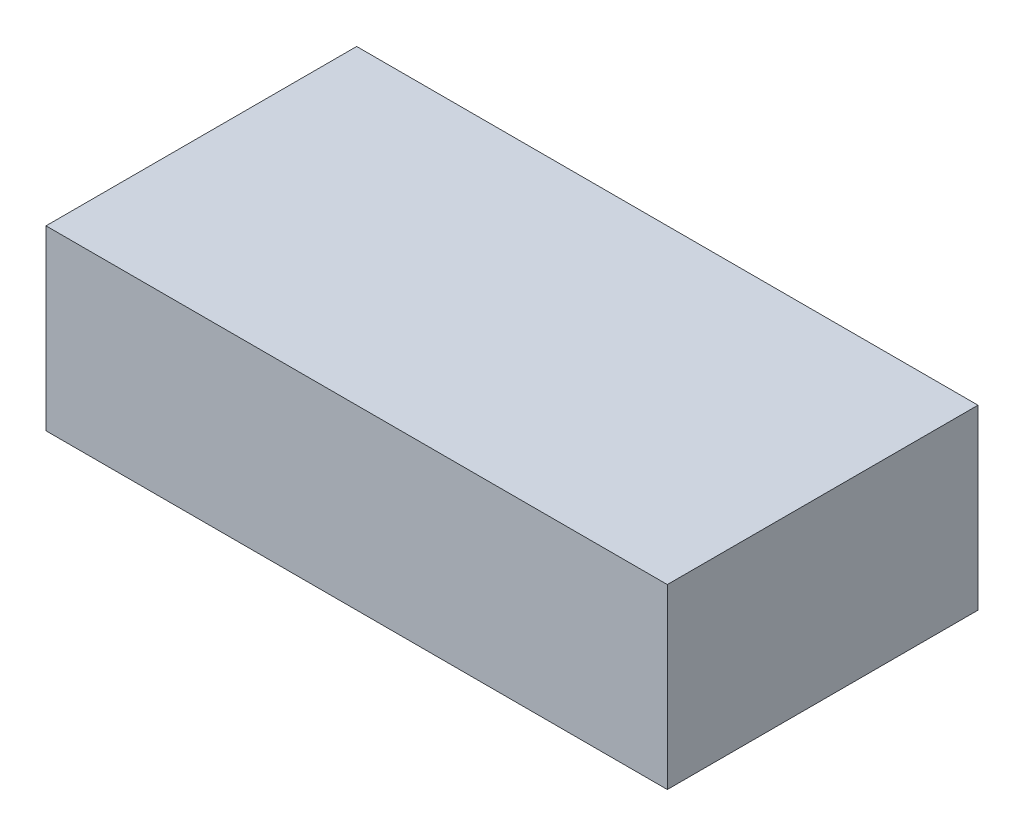
ISO-10303-21;
HEADER;
FILE_DESCRIPTION(('STEP AP214'),'2;1');
FILE_NAME('part.step','',(''),(''),'','','');
FILE_SCHEMA(('AUTOMOTIVE_DESIGN { 1 0 10303 214 1 1 1 1 }'));
ENDSEC;
DATA;
#1=APPLICATION_CONTEXT('core data for automotive mechanical design processes');
#2=APPLICATION_PROTOCOL_DEFINITION('international standard','automotive_design',2000,#1);
#3=PRODUCT_CONTEXT('',#1,'mechanical');
#4=PRODUCT('Part','Part','',(#3));
#5=PRODUCT_RELATED_PRODUCT_CATEGORY('part','',(#4));
#6=PRODUCT_DEFINITION_FORMATION('','',#4);
#7=PRODUCT_DEFINITION_CONTEXT('part definition',#1,'design');
#8=PRODUCT_DEFINITION('design','',#6,#7);
#9=PRODUCT_DEFINITION_SHAPE('','',#8);
#10=(LENGTH_UNIT() NAMED_UNIT(*) SI_UNIT(.MILLI.,.METRE.));
#11=(NAMED_UNIT(*) PLANE_ANGLE_UNIT() SI_UNIT($,.RADIAN.));
#12=(NAMED_UNIT(*) SI_UNIT($,.STERADIAN.) SOLID_ANGLE_UNIT());
#13=UNCERTAINTY_MEASURE_WITH_UNIT(LENGTH_MEASURE(1.E-05),#10,'distance_accuracy_value','');
#14=(GEOMETRIC_REPRESENTATION_CONTEXT(3) GLOBAL_UNCERTAINTY_ASSIGNED_CONTEXT((#13)) GLOBAL_UNIT_ASSIGNED_CONTEXT((#10,
#11,#12)) REPRESENTATION_CONTEXT('',''));
#15=CARTESIAN_POINT('',(0.,0.,0.));
#16=DIRECTION('',(0.,0.,1.));
#17=DIRECTION('',(1.,0.,0.));
#18=AXIS2_PLACEMENT_3D('',#15,#16,#17);
#19=CARTESIAN_POINT('',(0.,20.,0.));
#20=DIRECTION('',(1.,0.,0.));
#21=DIRECTION('',(0.,0.,-1.));
#22=AXIS2_PLACEMENT_3D('',#19,#20,#21);
#23=PLANE('',#22);
#24=DIRECTION('',(0.,0.,1.));
#25=VECTOR('',#24,1.);
#26=CARTESIAN_POINT('',(0.,0.,0.));
#27=LINE('',#26,#25);
#28=CARTESIAN_POINT('',(0.,0.,-35.));
#29=VERTEX_POINT('',#28);
#30=CARTESIAN_POINT('',(0.,0.,0.));
#31=VERTEX_POINT('',#30);
#32=EDGE_CURVE('E98',#29,#31,#27,.T.);
#33=ORIENTED_EDGE('',*,*,#32,.T.);
#34=DIRECTION('',(0.,-1.,0.));
#35=VECTOR('',#34,1.);
#36=CARTESIAN_POINT('',(0.,20.,0.));
#37=LINE('',#36,#35);
#38=CARTESIAN_POINT('',(0.,20.,0.));
#39=VERTEX_POINT('',#38);
#40=EDGE_CURVE('E11',#39,#31,#37,.T.);
#41=ORIENTED_EDGE('',*,*,#40,.F.);
#42=DIRECTION('',(0.,0.,1.));
#43=VECTOR('',#42,1.);
#44=CARTESIAN_POINT('',(0.,20.,0.));
#45=LINE('',#44,#43);
#46=CARTESIAN_POINT('',(0.,20.,-35.));
#47=VERTEX_POINT('',#46);
#48=EDGE_CURVE('E86',#47,#39,#45,.T.);
#49=ORIENTED_EDGE('',*,*,#48,.F.);
#50=DIRECTION('',(0.,-1.,0.));
#51=VECTOR('',#50,1.);
#52=CARTESIAN_POINT('',(0.,20.,-35.));
#53=LINE('',#52,#51);
#54=EDGE_CURVE('E94',#47,#29,#53,.T.);
#55=ORIENTED_EDGE('',*,*,#54,.T.);
#56=EDGE_LOOP('',(#33,#41,#49,#55));
#57=FACE_BOUND('',#56,.T.);
#58=ADVANCED_FACE('F35',(#57),#23,.F.);
#59=CARTESIAN_POINT('',(0.,20.,0.));
#60=DIRECTION('',(0.,0.,-1.));
#61=DIRECTION('',(-1.,0.,0.));
#62=AXIS2_PLACEMENT_3D('',#59,#60,#61);
#63=PLANE('',#62);
#64=DIRECTION('',(1.,0.,0.));
#65=VECTOR('',#64,1.);
#66=CARTESIAN_POINT('',(0.,0.,0.));
#67=LINE('',#66,#65);
#68=CARTESIAN_POINT('',(70.,0.,0.));
#69=VERTEX_POINT('',#68);
#70=EDGE_CURVE('E90',#31,#69,#67,.T.);
#71=ORIENTED_EDGE('',*,*,#70,.T.);
#72=DIRECTION('',(0.,-1.,0.));
#73=VECTOR('',#72,1.);
#74=CARTESIAN_POINT('',(70.,20.,0.));
#75=LINE('',#74,#73);
#76=CARTESIAN_POINT('',(70.,20.,0.));
#77=VERTEX_POINT('',#76);
#78=EDGE_CURVE('E43',#77,#69,#75,.T.);
#79=ORIENTED_EDGE('',*,*,#78,.F.);
#80=DIRECTION('',(1.,0.,0.));
#81=VECTOR('',#80,1.);
#82=CARTESIAN_POINT('',(0.,20.,0.));
#83=LINE('',#82,#81);
#84=EDGE_CURVE('E81',#39,#77,#83,.T.);
#85=ORIENTED_EDGE('',*,*,#84,.F.);
#86=ORIENTED_EDGE('',*,*,#40,.T.);
#87=EDGE_LOOP('',(#71,#79,#85,#86));
#88=FACE_BOUND('',#87,.T.);
#89=ADVANCED_FACE('F89',(#88),#63,.F.);
#90=CARTESIAN_POINT('',(70.,20.,0.));
#91=DIRECTION('',(-1.,0.,0.));
#92=DIRECTION('',(0.,0.,1.));
#93=AXIS2_PLACEMENT_3D('',#90,#91,#92);
#94=PLANE('',#93);
#95=DIRECTION('',(0.,0.,-1.));
#96=VECTOR('',#95,1.);
#97=CARTESIAN_POINT('',(70.,0.,0.));
#98=LINE('',#97,#96);
#99=CARTESIAN_POINT('',(70.,0.,-35.));
#100=VERTEX_POINT('',#99);
#101=EDGE_CURVE('E68',#69,#100,#98,.T.);
#102=ORIENTED_EDGE('',*,*,#101,.T.);
#103=DIRECTION('',(0.,-1.,0.));
#104=VECTOR('',#103,1.);
#105=CARTESIAN_POINT('',(70.,20.,-35.));
#106=LINE('',#105,#104);
#107=CARTESIAN_POINT('',(70.,20.,-35.));
#108=VERTEX_POINT('',#107);
#109=EDGE_CURVE('E91',#108,#100,#106,.T.);
#110=ORIENTED_EDGE('',*,*,#109,.F.);
#111=DIRECTION('',(0.,0.,-1.));
#112=VECTOR('',#111,1.);
#113=CARTESIAN_POINT('',(70.,20.,0.));
#114=LINE('',#113,#112);
#115=EDGE_CURVE('E84',#77,#108,#114,.T.);
#116=ORIENTED_EDGE('',*,*,#115,.F.);
#117=ORIENTED_EDGE('',*,*,#78,.T.);
#118=EDGE_LOOP('',(#102,#110,#116,#117));
#119=FACE_BOUND('',#118,.T.);
#120=ADVANCED_FACE('F92',(#119),#94,.F.);
#121=CARTESIAN_POINT('',(0.,20.,-35.));
#122=DIRECTION('',(0.,0.,1.));
#123=DIRECTION('',(1.,0.,0.));
#124=AXIS2_PLACEMENT_3D('',#121,#122,#123);
#125=PLANE('',#124);
#126=DIRECTION('',(-1.,0.,0.));
#127=VECTOR('',#126,1.);
#128=CARTESIAN_POINT('',(0.,0.,-35.));
#129=LINE('',#128,#127);
#130=EDGE_CURVE('E74',#100,#29,#129,.T.);
#131=ORIENTED_EDGE('',*,*,#130,.T.);
#132=ORIENTED_EDGE('',*,*,#54,.F.);
#133=DIRECTION('',(-1.,0.,0.));
#134=VECTOR('',#133,1.);
#135=CARTESIAN_POINT('',(0.,20.,-35.));
#136=LINE('',#135,#134);
#137=EDGE_CURVE('E51',#108,#47,#136,.T.);
#138=ORIENTED_EDGE('',*,*,#137,.F.);
#139=ORIENTED_EDGE('',*,*,#109,.T.);
#140=EDGE_LOOP('',(#131,#132,#138,#139));
#141=FACE_BOUND('',#140,.T.);
#142=ADVANCED_FACE('F105',(#141),#125,.F.);
#143=CARTESIAN_POINT('',(0.,20.,0.));
#144=DIRECTION('',(0.,-1.,0.));
#145=DIRECTION('',(0.,0.,-1.));
#146=AXIS2_PLACEMENT_3D('',#143,#144,#145);
#147=PLANE('',#146);
#148=ORIENTED_EDGE('',*,*,#48,.T.);
#149=ORIENTED_EDGE('',*,*,#84,.T.);
#150=ORIENTED_EDGE('',*,*,#115,.T.);
#151=ORIENTED_EDGE('',*,*,#137,.T.);
#152=EDGE_LOOP('',(#148,#149,#150,#151));
#153=FACE_BOUND('',#152,.T.);
#154=ADVANCED_FACE('F82',(#153),#147,.F.);
#155=CARTESIAN_POINT('',(0.,0.,0.));
#156=DIRECTION('',(0.,-1.,0.));
#157=DIRECTION('',(0.,0.,-1.));
#158=AXIS2_PLACEMENT_3D('',#155,#156,#157);
#159=PLANE('',#158);
#160=ORIENTED_EDGE('',*,*,#32,.F.);
#161=ORIENTED_EDGE('',*,*,#130,.F.);
#162=ORIENTED_EDGE('',*,*,#101,.F.);
#163=ORIENTED_EDGE('',*,*,#70,.F.);
#164=EDGE_LOOP('',(#160,#161,#162,#163));
#165=FACE_BOUND('',#164,.T.);
#166=ADVANCED_FACE('F108',(#165),#159,.T.);
#167=CLOSED_SHELL('',(#58,#89,#120,#142,#154,#166));
#168=MANIFOLD_SOLID_BREP('B2',#167);
#169=ADVANCED_BREP_SHAPE_REPRESENTATION('',(#18,#168),#14);
#170=SHAPE_DEFINITION_REPRESENTATION(#9,#169);
ENDSEC;
END-ISO-10303-21;
